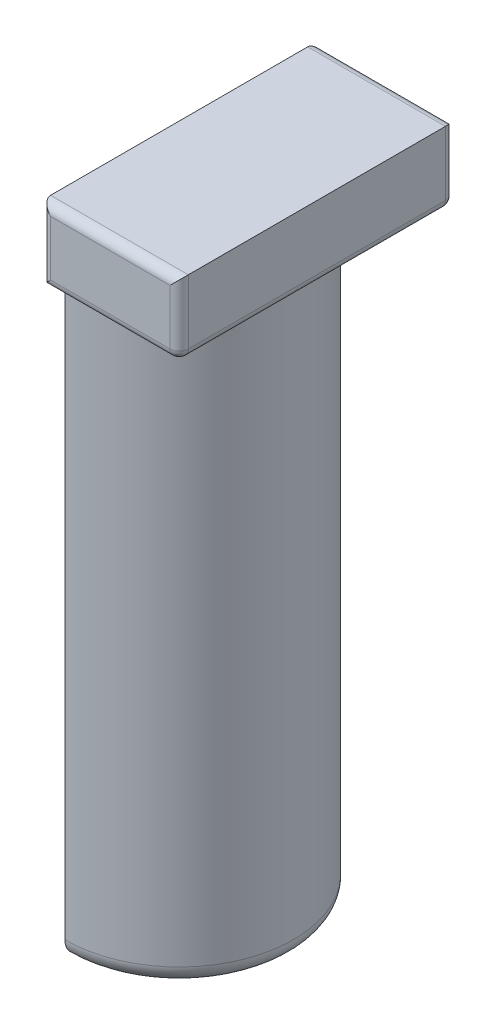
ISO-10303-21;
HEADER;
FILE_DESCRIPTION(('STEP AP214'),'2;1');
FILE_NAME('part.step','',(''),(''),'','','');
FILE_SCHEMA(('AUTOMOTIVE_DESIGN { 1 0 10303 214 1 1 1 1 }'));
ENDSEC;
DATA;
#1=APPLICATION_CONTEXT('core data for automotive mechanical design processes');
#2=APPLICATION_PROTOCOL_DEFINITION('international standard','automotive_design',2000,#1);
#3=PRODUCT_CONTEXT('',#1,'mechanical');
#4=PRODUCT('Part','Part','',(#3));
#5=PRODUCT_RELATED_PRODUCT_CATEGORY('part','',(#4));
#6=PRODUCT_DEFINITION_FORMATION('','',#4);
#7=PRODUCT_DEFINITION_CONTEXT('part definition',#1,'design');
#8=PRODUCT_DEFINITION('design','',#6,#7);
#9=PRODUCT_DEFINITION_SHAPE('','',#8);
#10=(LENGTH_UNIT() NAMED_UNIT(*) SI_UNIT(.MILLI.,.METRE.));
#11=(NAMED_UNIT(*) PLANE_ANGLE_UNIT() SI_UNIT($,.RADIAN.));
#12=(NAMED_UNIT(*) SI_UNIT($,.STERADIAN.) SOLID_ANGLE_UNIT());
#13=UNCERTAINTY_MEASURE_WITH_UNIT(LENGTH_MEASURE(1.E-05),#10,'distance_accuracy_value','');
#14=(GEOMETRIC_REPRESENTATION_CONTEXT(3) GLOBAL_UNCERTAINTY_ASSIGNED_CONTEXT((#13)) GLOBAL_UNIT_ASSIGNED_CONTEXT((#10,
#11,#12)) REPRESENTATION_CONTEXT('',''));
#15=CARTESIAN_POINT('',(0.,0.,0.));
#16=DIRECTION('',(0.,0.,1.));
#17=DIRECTION('',(1.,0.,0.));
#18=AXIS2_PLACEMENT_3D('',#15,#16,#17);
#19=CARTESIAN_POINT('',(0.,8.,0.));
#20=DIRECTION('',(-1.,0.,0.));
#21=DIRECTION('',(0.,0.,1.));
#22=AXIS2_PLACEMENT_3D('',#19,#20,#21);
#23=PLANE('',#22);
#24=DIRECTION('',(0.,0.,-1.));
#25=VECTOR('',#24,1.);
#26=CARTESIAN_POINT('',(0.,1.,0.));
#27=LINE('',#26,#25);
#28=CARTESIAN_POINT('',(0.,1.,-1.));
#29=VERTEX_POINT('',#28);
#30=CARTESIAN_POINT('',(0.,1.,-29.));
#31=VERTEX_POINT('',#30);
#32=EDGE_CURVE('E177',#29,#31,#27,.T.);
#33=ORIENTED_EDGE('',*,*,#32,.T.);
#34=DIRECTION('',(0.,-1.,0.));
#35=VECTOR('',#34,1.);
#36=CARTESIAN_POINT('',(0.,8.,-29.));
#37=LINE('',#36,#35);
#38=CARTESIAN_POINT('',(0.,8.,-29.));
#39=VERTEX_POINT('',#38);
#40=EDGE_CURVE('E181',#31,#39,#37,.F.);
#41=ORIENTED_EDGE('',*,*,#40,.T.);
#42=DIRECTION('',(0.,0.,-1.));
#43=VECTOR('',#42,1.);
#44=CARTESIAN_POINT('',(0.,8.,0.));
#45=LINE('',#44,#43);
#46=CARTESIAN_POINT('',(0.,8.,-1.));
#47=VERTEX_POINT('',#46);
#48=EDGE_CURVE('E153',#47,#39,#45,.T.);
#49=ORIENTED_EDGE('',*,*,#48,.F.);
#50=DIRECTION('',(0.,-1.,0.));
#51=VECTOR('',#50,1.);
#52=CARTESIAN_POINT('',(0.,8.,-1.));
#53=LINE('',#52,#51);
#54=EDGE_CURVE('E179',#47,#29,#53,.T.);
#55=ORIENTED_EDGE('',*,*,#54,.T.);
#56=EDGE_LOOP('',(#33,#41,#49,#55));
#57=FACE_BOUND('',#56,.T.);
#58=ADVANCED_FACE('F37',(#57),#23,.F.);
#59=CARTESIAN_POINT('',(0.,8.,-30.));
#60=DIRECTION('',(0.,0.,1.));
#61=DIRECTION('',(1.,0.,0.));
#62=AXIS2_PLACEMENT_3D('',#59,#60,#61);
#63=PLANE('',#62);
#64=DIRECTION('',(-1.,0.,0.));
#65=VECTOR('',#64,1.);
#66=CARTESIAN_POINT('',(0.,7.,-30.));
#67=LINE('',#66,#65);
#68=CARTESIAN_POINT('',(-14.,7.,-30.));
#69=VERTEX_POINT('',#68);
#70=CARTESIAN_POINT('',(-1.,7.,-30.));
#71=VERTEX_POINT('',#70);
#72=EDGE_CURVE('E172',#69,#71,#67,.F.);
#73=ORIENTED_EDGE('',*,*,#72,.T.);
#74=DIRECTION('',(0.,-1.,0.));
#75=VECTOR('',#74,1.);
#76=CARTESIAN_POINT('',(-1.,8.,-30.));
#77=LINE('',#76,#75);
#78=CARTESIAN_POINT('',(-1.,1.,-30.));
#79=VERTEX_POINT('',#78);
#80=EDGE_CURVE('E174',#71,#79,#77,.T.);
#81=ORIENTED_EDGE('',*,*,#80,.T.);
#82=DIRECTION('',(-1.,0.,0.));
#83=VECTOR('',#82,1.);
#84=CARTESIAN_POINT('',(0.,1.,-30.));
#85=LINE('',#84,#83);
#86=CARTESIAN_POINT('',(-14.,1.,-30.));
#87=VERTEX_POINT('',#86);
#88=EDGE_CURVE('E168',#79,#87,#85,.T.);
#89=ORIENTED_EDGE('',*,*,#88,.T.);
#90=DIRECTION('',(0.,1.,0.));
#91=VECTOR('',#90,1.);
#92=CARTESIAN_POINT('',(-14.,8.,-30.));
#93=LINE('',#92,#91);
#94=EDGE_CURVE('E170',#87,#69,#93,.T.);
#95=ORIENTED_EDGE('',*,*,#94,.T.);
#96=EDGE_LOOP('',(#73,#81,#89,#95));
#97=FACE_BOUND('',#96,.T.);
#98=ADVANCED_FACE('F252',(#97),#63,.F.);
#99=CARTESIAN_POINT('',(0.,8.,0.));
#100=DIRECTION('',(0.,0.,-1.));
#101=DIRECTION('',(-1.,0.,0.));
#102=AXIS2_PLACEMENT_3D('',#99,#100,#101);
#103=PLANE('',#102);
#104=DIRECTION('',(1.,0.,0.));
#105=VECTOR('',#104,1.);
#106=CARTESIAN_POINT('',(0.,1.,0.));
#107=LINE('',#106,#105);
#108=CARTESIAN_POINT('',(-14.,1.,0.));
#109=VERTEX_POINT('',#108);
#110=CARTESIAN_POINT('',(-1.,1.,0.));
#111=VERTEX_POINT('',#110);
#112=EDGE_CURVE('E46',#109,#111,#107,.T.);
#113=ORIENTED_EDGE('',*,*,#112,.T.);
#114=DIRECTION('',(0.,-1.,0.));
#115=VECTOR('',#114,1.);
#116=CARTESIAN_POINT('',(-1.,8.,0.));
#117=LINE('',#116,#115);
#118=CARTESIAN_POINT('',(-1.,7.,0.));
#119=VERTEX_POINT('',#118);
#120=EDGE_CURVE('E11',#111,#119,#117,.F.);
#121=ORIENTED_EDGE('',*,*,#120,.T.);
#122=DIRECTION('',(1.,0.,0.));
#123=VECTOR('',#122,1.);
#124=CARTESIAN_POINT('',(-15.,7.,0.));
#125=LINE('',#124,#123);
#126=CARTESIAN_POINT('',(-14.,7.,0.));
#127=VERTEX_POINT('',#126);
#128=EDGE_CURVE('E197',#119,#127,#125,.F.);
#129=ORIENTED_EDGE('',*,*,#128,.T.);
#130=DIRECTION('',(0.,1.,0.));
#131=VECTOR('',#130,1.);
#132=CARTESIAN_POINT('',(-14.,8.,0.));
#133=LINE('',#132,#131);
#134=EDGE_CURVE('E57',#127,#109,#133,.F.);
#135=ORIENTED_EDGE('',*,*,#134,.T.);
#136=EDGE_LOOP('',(#113,#121,#129,#135));
#137=FACE_BOUND('',#136,.T.);
#138=ADVANCED_FACE('F285',(#137),#103,.F.);
#139=CARTESIAN_POINT('',(0.,8.,0.));
#140=DIRECTION('',(0.,1.,0.));
#141=DIRECTION('',(0.,0.,1.));
#142=AXIS2_PLACEMENT_3D('',#139,#140,#141);
#143=PLANE('',#142);
#144=ORIENTED_EDGE('',*,*,#48,.T.);
#145=DIRECTION('',(-1.,0.,0.));
#146=VECTOR('',#145,1.);
#147=CARTESIAN_POINT('',(-15.,8.,-29.));
#148=LINE('',#147,#146);
#149=CARTESIAN_POINT('',(-15.,8.,-29.));
#150=VERTEX_POINT('',#149);
#151=EDGE_CURVE('E186',#39,#150,#148,.T.);
#152=ORIENTED_EDGE('',*,*,#151,.T.);
#153=DIRECTION('',(0.,0.,-1.));
#154=VECTOR('',#153,1.);
#155=CARTESIAN_POINT('',(-15.,8.,-30.));
#156=LINE('',#155,#154);
#157=CARTESIAN_POINT('',(-15.,8.,-0.999999999999997));
#158=VERTEX_POINT('',#157);
#159=EDGE_CURVE('E147',#158,#150,#156,.T.);
#160=ORIENTED_EDGE('',*,*,#159,.F.);
#161=DIRECTION('',(1.,0.,0.));
#162=VECTOR('',#161,1.);
#163=CARTESIAN_POINT('',(0.,8.,-1.));
#164=LINE('',#163,#162);
#165=EDGE_CURVE('E184',#158,#47,#164,.T.);
#166=ORIENTED_EDGE('',*,*,#165,.T.);
#167=EDGE_LOOP('',(#144,#152,#160,#166));
#168=FACE_BOUND('',#167,.T.);
#169=ADVANCED_FACE('F408',(#168),#143,.T.);
#170=CARTESIAN_POINT('',(0.,0.,0.));
#171=DIRECTION('',(0.,1.,0.));
#172=DIRECTION('',(0.,0.,1.));
#173=AXIS2_PLACEMENT_3D('',#170,#171,#172);
#174=PLANE('',#173);
#175=DIRECTION('',(0.,0.,-1.));
#176=VECTOR('',#175,1.);
#177=CARTESIAN_POINT('',(-15.,0.,0.));
#178=LINE('',#177,#176);
#179=CARTESIAN_POINT('',(-15.,0.,-27.45));
#180=VERTEX_POINT('',#179);
#181=CARTESIAN_POINT('',(-15.,0.,-29.));
#182=VERTEX_POINT('',#181);
#183=EDGE_CURVE('E139',#180,#182,#178,.T.);
#184=ORIENTED_EDGE('',*,*,#183,.T.);
#185=DIRECTION('',(-1.,0.,0.));
#186=VECTOR('',#185,1.);
#187=CARTESIAN_POINT('',(0.,0.,-29.));
#188=LINE('',#187,#186);
#189=CARTESIAN_POINT('',(-1.,0.,-29.));
#190=VERTEX_POINT('',#189);
#191=EDGE_CURVE('E195',#182,#190,#188,.F.);
#192=ORIENTED_EDGE('',*,*,#191,.T.);
#193=DIRECTION('',(0.,0.,-1.));
#194=VECTOR('',#193,1.);
#195=CARTESIAN_POINT('',(-1.,0.,0.));
#196=LINE('',#195,#194);
#197=CARTESIAN_POINT('',(-1.,0.,-1.));
#198=VERTEX_POINT('',#197);
#199=EDGE_CURVE('E192',#190,#198,#196,.F.);
#200=ORIENTED_EDGE('',*,*,#199,.T.);
#201=DIRECTION('',(1.,0.,0.));
#202=VECTOR('',#201,1.);
#203=CARTESIAN_POINT('',(0.,0.,-1.));
#204=LINE('',#203,#202);
#205=CARTESIAN_POINT('',(-15.,0.,-1.));
#206=VERTEX_POINT('',#205);
#207=EDGE_CURVE('E133',#198,#206,#204,.F.);
#208=ORIENTED_EDGE('',*,*,#207,.T.);
#209=CARTESIAN_POINT('',(-15.,0.,-2.55));
#210=VERTEX_POINT('',#209);
#211=EDGE_CURVE('E126',#206,#210,#178,.T.);
#212=ORIENTED_EDGE('',*,*,#211,.T.);
#213=CARTESIAN_POINT('',(-15.,0.,-15.));
#214=DIRECTION('',(0.,-1.,0.));
#215=DIRECTION('',(0.,0.,-1.));
#216=AXIS2_PLACEMENT_3D('',#213,#214,#215);
#217=CIRCLE('',#216,12.45);
#218=EDGE_CURVE('E131',#180,#210,#217,.T.);
#219=ORIENTED_EDGE('',*,*,#218,.F.);
#220=EDGE_LOOP('',(#184,#192,#200,#208,#212,#219));
#221=FACE_BOUND('',#220,.T.);
#222=ADVANCED_FACE('F129',(#221),#174,.F.);
#223=CARTESIAN_POINT('',(-15.,-65.,-15.));
#224=DIRECTION('',(0.,1.,0.));
#225=DIRECTION('',(0.,0.,1.));
#226=AXIS2_PLACEMENT_3D('',#223,#224,#225);
#227=CYLINDRICAL_SURFACE('',#226,12.45);
#228=DIRECTION('',(0.,1.,0.));
#229=VECTOR('',#228,1.);
#230=CARTESIAN_POINT('',(-15.,-65.,-2.55));
#231=LINE('',#230,#229);
#232=CARTESIAN_POINT('',(-15.,-63.,-2.55));
#233=VERTEX_POINT('',#232);
#234=EDGE_CURVE('E137',#210,#233,#231,.F.);
#235=ORIENTED_EDGE('',*,*,#234,.T.);
#236=CARTESIAN_POINT('',(-15.,-63.,-15.));
#237=DIRECTION('',(0.,-1.,0.));
#238=DIRECTION('',(0.,0.,-1.));
#239=AXIS2_PLACEMENT_3D('',#236,#237,#238);
#240=CIRCLE('',#239,12.45);
#241=CARTESIAN_POINT('',(-15.,-63.,-27.45));
#242=VERTEX_POINT('',#241);
#243=EDGE_CURVE('E166',#233,#242,#240,.F.);
#244=ORIENTED_EDGE('',*,*,#243,.T.);
#245=DIRECTION('',(0.,1.,0.));
#246=VECTOR('',#245,1.);
#247=CARTESIAN_POINT('',(-15.,-65.,-27.45));
#248=LINE('',#247,#246);
#249=EDGE_CURVE('E136',#242,#180,#248,.T.);
#250=ORIENTED_EDGE('',*,*,#249,.T.);
#251=ORIENTED_EDGE('',*,*,#218,.T.);
#252=EDGE_LOOP('',(#235,#244,#250,#251));
#253=FACE_BOUND('',#252,.T.);
#254=ADVANCED_FACE('F149',(#253),#227,.T.);
#255=CARTESIAN_POINT('',(-15.,-65.,-15.));
#256=DIRECTION('',(0.,-1.,0.));
#257=DIRECTION('',(0.,0.,-1.));
#258=AXIS2_PLACEMENT_3D('',#255,#256,#257);
#259=PLANE('',#258);
#260=DIRECTION('',(0.,0.,1.));
#261=VECTOR('',#260,1.);
#262=CARTESIAN_POINT('',(-15.,-65.,-15.));
#263=LINE('',#262,#261);
#264=CARTESIAN_POINT('',(-15.,-65.,-25.45));
#265=VERTEX_POINT('',#264);
#266=CARTESIAN_POINT('',(-15.,-65.,-4.55));
#267=VERTEX_POINT('',#266);
#268=EDGE_CURVE('E152',#265,#267,#263,.T.);
#269=ORIENTED_EDGE('',*,*,#268,.F.);
#270=CARTESIAN_POINT('',(-15.,-65.,-15.));
#271=DIRECTION('',(0.,-1.,0.));
#272=DIRECTION('',(0.,0.,-1.));
#273=AXIS2_PLACEMENT_3D('',#270,#271,#272);
#274=CIRCLE('',#273,10.45);
#275=EDGE_CURVE('E155',#265,#267,#274,.T.);
#276=ORIENTED_EDGE('',*,*,#275,.T.);
#277=EDGE_LOOP('',(#269,#276));
#278=FACE_BOUND('',#277,.T.);
#279=ADVANCED_FACE('F386',(#278),#259,.T.);
#280=CARTESIAN_POINT('',(-15.,-65.,-30.));
#281=DIRECTION('',(1.,0.,0.));
#282=DIRECTION('',(0.,1.,0.));
#283=AXIS2_PLACEMENT_3D('',#280,#281,#282);
#284=PLANE('',#283);
#285=ORIENTED_EDGE('',*,*,#159,.T.);
#286=DIRECTION('',(0.,1.,0.));
#287=VECTOR('',#286,1.);
#288=CARTESIAN_POINT('',(-15.,-65.,-29.));
#289=LINE('',#288,#287);
#290=EDGE_CURVE('E190',#150,#182,#289,.F.);
#291=ORIENTED_EDGE('',*,*,#290,.T.);
#292=ORIENTED_EDGE('',*,*,#183,.F.);
#293=ORIENTED_EDGE('',*,*,#249,.F.);
#294=CARTESIAN_POINT('',(-15.,-63.,-25.45));
#295=DIRECTION('',(1.,0.,0.));
#296=DIRECTION('',(0.,1.,0.));
#297=AXIS2_PLACEMENT_3D('',#294,#295,#296);
#298=CIRCLE('',#297,2.);
#299=EDGE_CURVE('E163',#242,#265,#298,.F.);
#300=ORIENTED_EDGE('',*,*,#299,.T.);
#301=ORIENTED_EDGE('',*,*,#268,.T.);
#302=CARTESIAN_POINT('',(-15.,-63.,-4.55));
#303=DIRECTION('',(1.,0.,0.));
#304=DIRECTION('',(0.,1.,0.));
#305=AXIS2_PLACEMENT_3D('',#302,#303,#304);
#306=CIRCLE('',#305,2.);
#307=EDGE_CURVE('E144',#267,#233,#306,.F.);
#308=ORIENTED_EDGE('',*,*,#307,.T.);
#309=ORIENTED_EDGE('',*,*,#234,.F.);
#310=ORIENTED_EDGE('',*,*,#211,.F.);
#311=DIRECTION('',(0.,1.,0.));
#312=VECTOR('',#311,1.);
#313=CARTESIAN_POINT('',(-15.,-65.,-1.));
#314=LINE('',#313,#312);
#315=EDGE_CURVE('E188',#206,#158,#314,.T.);
#316=ORIENTED_EDGE('',*,*,#315,.T.);
#317=EDGE_LOOP('',(#285,#291,#292,#293,#300,#301,#308,#309,#310,#316));
#318=FACE_BOUND('',#317,.T.);
#319=ADVANCED_FACE('F142',(#318),#284,.F.);
#320=CARTESIAN_POINT('',(-15.,-63.,-15.));
#321=DIRECTION('',(0.,-1.,0.));
#322=DIRECTION('',(0.,0.,-1.));
#323=AXIS2_PLACEMENT_3D('',#320,#321,#322);
#324=TOROIDAL_SURFACE('',#323,10.45,2.);
#325=ORIENTED_EDGE('',*,*,#299,.F.);
#326=ORIENTED_EDGE('',*,*,#243,.F.);
#327=ORIENTED_EDGE('',*,*,#307,.F.);
#328=ORIENTED_EDGE('',*,*,#275,.F.);
#329=EDGE_LOOP('',(#325,#326,#327,#328));
#330=FACE_BOUND('',#329,.T.);
#331=ADVANCED_FACE('F289',(#330),#324,.T.);
#332=CARTESIAN_POINT('',(-14.,-65.,-1.));
#333=DIRECTION('',(0.,1.,0.));
#334=DIRECTION('',(-1.,0.,0.));
#335=AXIS2_PLACEMENT_3D('',#332,#333,#334);
#336=CYLINDRICAL_SURFACE('',#335,1.);
#337=CARTESIAN_POINT('',(-14.,1.,-1.));
#338=DIRECTION('',(-0.707106781186547,0.707106781186547,0.));
#339=DIRECTION('',(0.707106781186547,0.707106781186547,0.));
#340=AXIS2_PLACEMENT_3D('',#337,#338,#339);
#341=ELLIPSE('',#340,1.41421356237309,1.);
#342=EDGE_CURVE('E227',#109,#206,#341,.F.);
#343=ORIENTED_EDGE('',*,*,#342,.F.);
#344=ORIENTED_EDGE('',*,*,#134,.F.);
#345=CARTESIAN_POINT('',(-14.,7.,-1.));
#346=DIRECTION('',(-0.707106781186547,-0.707106781186547,0.));
#347=DIRECTION('',(-0.707106781186547,0.707106781186547,0.));
#348=AXIS2_PLACEMENT_3D('',#345,#346,#347);
#349=ELLIPSE('',#348,1.41421356237309,1.);
#350=EDGE_CURVE('E41',#158,#127,#349,.F.);
#351=ORIENTED_EDGE('',*,*,#350,.F.);
#352=ORIENTED_EDGE('',*,*,#315,.F.);
#353=EDGE_LOOP('',(#343,#344,#351,#352));
#354=FACE_BOUND('',#353,.T.);
#355=ADVANCED_FACE('F39',(#354),#336,.T.);
#356=CARTESIAN_POINT('',(0.,7.,-1.));
#357=DIRECTION('',(-1.,0.,0.));
#358=DIRECTION('',(0.,0.,1.));
#359=AXIS2_PLACEMENT_3D('',#356,#357,#358);
#360=CYLINDRICAL_SURFACE('',#359,1.);
#361=ORIENTED_EDGE('',*,*,#350,.T.);
#362=ORIENTED_EDGE('',*,*,#128,.F.);
#363=CARTESIAN_POINT('',(-1.,7.,-1.));
#364=DIRECTION('',(-0.707106781186547,0.707106781186547,0.));
#365=DIRECTION('',(-0.707106781186547,-0.707106781186547,0.));
#366=AXIS2_PLACEMENT_3D('',#363,#364,#365);
#367=ELLIPSE('',#366,1.41421356237309,1.);
#368=EDGE_CURVE('E226',#47,#119,#367,.F.);
#369=ORIENTED_EDGE('',*,*,#368,.F.);
#370=ORIENTED_EDGE('',*,*,#165,.F.);
#371=EDGE_LOOP('',(#361,#362,#369,#370));
#372=FACE_BOUND('',#371,.T.);
#373=ADVANCED_FACE('F271',(#372),#360,.T.);
#374=CARTESIAN_POINT('',(0.,1.,-1.));
#375=DIRECTION('',(1.,0.,0.));
#376=DIRECTION('',(0.,0.,-1.));
#377=AXIS2_PLACEMENT_3D('',#374,#375,#376);
#378=CYLINDRICAL_SURFACE('',#377,1.);
#379=ORIENTED_EDGE('',*,*,#342,.T.);
#380=ORIENTED_EDGE('',*,*,#207,.F.);
#381=CARTESIAN_POINT('',(-1.,1.,-1.));
#382=DIRECTION('',(1.,0.,0.));
#383=DIRECTION('',(0.,0.,-1.));
#384=AXIS2_PLACEMENT_3D('',#381,#382,#383);
#385=CIRCLE('',#384,1.);
#386=EDGE_CURVE('E223',#111,#198,#385,.T.);
#387=ORIENTED_EDGE('',*,*,#386,.F.);
#388=ORIENTED_EDGE('',*,*,#112,.F.);
#389=EDGE_LOOP('',(#379,#380,#387,#388));
#390=FACE_BOUND('',#389,.T.);
#391=ADVANCED_FACE('F268',(#390),#378,.T.);
#392=CARTESIAN_POINT('',(-1.,8.,-1.));
#393=DIRECTION('',(0.,-1.,0.));
#394=DIRECTION('',(0.,0.,-1.));
#395=AXIS2_PLACEMENT_3D('',#392,#393,#394);
#396=CYLINDRICAL_SURFACE('',#395,1.);
#397=ORIENTED_EDGE('',*,*,#368,.T.);
#398=ORIENTED_EDGE('',*,*,#120,.F.);
#399=CARTESIAN_POINT('',(-1.,1.,-1.));
#400=DIRECTION('',(0.,-1.,0.));
#401=DIRECTION('',(0.,0.,-1.));
#402=AXIS2_PLACEMENT_3D('',#399,#400,#401);
#403=CIRCLE('',#402,1.);
#404=EDGE_CURVE('E220',#29,#111,#403,.T.);
#405=ORIENTED_EDGE('',*,*,#404,.F.);
#406=ORIENTED_EDGE('',*,*,#54,.F.);
#407=EDGE_LOOP('',(#397,#398,#405,#406));
#408=FACE_BOUND('',#407,.T.);
#409=ADVANCED_FACE('F270',(#408),#396,.T.);
#410=CARTESIAN_POINT('',(-1.,1.,-1.));
#411=DIRECTION('',(0.,0.,1.));
#412=DIRECTION('',(1.,0.,0.));
#413=AXIS2_PLACEMENT_3D('',#410,#411,#412);
#414=SPHERICAL_SURFACE('',#413,1.);
#415=ORIENTED_EDGE('',*,*,#404,.T.);
#416=ORIENTED_EDGE('',*,*,#386,.T.);
#417=CARTESIAN_POINT('',(-1.,1.,-1.));
#418=DIRECTION('',(0.,0.,1.));
#419=DIRECTION('',(1.,0.,0.));
#420=AXIS2_PLACEMENT_3D('',#417,#418,#419);
#421=CIRCLE('',#420,1.);
#422=EDGE_CURVE('E214',#29,#198,#421,.F.);
#423=ORIENTED_EDGE('',*,*,#422,.F.);
#424=EDGE_LOOP('',(#415,#416,#423));
#425=FACE_BOUND('',#424,.T.);
#426=ADVANCED_FACE('F265',(#425),#414,.T.);
#427=CARTESIAN_POINT('',(-14.,8.,-29.));
#428=DIRECTION('',(0.,1.,0.));
#429=DIRECTION('',(-1.,0.,0.));
#430=AXIS2_PLACEMENT_3D('',#427,#428,#429);
#431=CYLINDRICAL_SURFACE('',#430,1.);
#432=CARTESIAN_POINT('',(-14.,7.,-29.));
#433=DIRECTION('',(0.707106781186547,0.707106781186547,0.));
#434=DIRECTION('',(-0.707106781186547,0.707106781186547,0.));
#435=AXIS2_PLACEMENT_3D('',#432,#433,#434);
#436=ELLIPSE('',#435,1.41421356237309,1.);
#437=EDGE_CURVE('E211',#69,#150,#436,.T.);
#438=ORIENTED_EDGE('',*,*,#437,.F.);
#439=ORIENTED_EDGE('',*,*,#94,.F.);
#440=CARTESIAN_POINT('',(-14.,1.,-29.));
#441=DIRECTION('',(-0.707106781186547,0.707106781186547,0.));
#442=DIRECTION('',(-0.707106781186547,-0.707106781186547,0.));
#443=AXIS2_PLACEMENT_3D('',#440,#441,#442);
#444=ELLIPSE('',#443,1.41421356237309,1.);
#445=EDGE_CURVE('E217',#182,#87,#444,.F.);
#446=ORIENTED_EDGE('',*,*,#445,.F.);
#447=ORIENTED_EDGE('',*,*,#290,.F.);
#448=EDGE_LOOP('',(#438,#439,#446,#447));
#449=FACE_BOUND('',#448,.T.);
#450=ADVANCED_FACE('F242',(#449),#431,.T.);
#451=CARTESIAN_POINT('',(0.,1.,-29.));
#452=DIRECTION('',(-1.,0.,0.));
#453=DIRECTION('',(0.,0.,1.));
#454=AXIS2_PLACEMENT_3D('',#451,#452,#453);
#455=CYLINDRICAL_SURFACE('',#454,1.);
#456=ORIENTED_EDGE('',*,*,#445,.T.);
#457=ORIENTED_EDGE('',*,*,#88,.F.);
#458=CARTESIAN_POINT('',(-1.,1.,-29.));
#459=DIRECTION('',(1.,0.,0.));
#460=DIRECTION('',(0.,0.,-1.));
#461=AXIS2_PLACEMENT_3D('',#458,#459,#460);
#462=CIRCLE('',#461,1.);
#463=EDGE_CURVE('E208',#190,#79,#462,.T.);
#464=ORIENTED_EDGE('',*,*,#463,.F.);
#465=ORIENTED_EDGE('',*,*,#191,.F.);
#466=EDGE_LOOP('',(#456,#457,#464,#465));
#467=FACE_BOUND('',#466,.T.);
#468=ADVANCED_FACE('F255',(#467),#455,.T.);
#469=CARTESIAN_POINT('',(-1.,1.,0.));
#470=DIRECTION('',(0.,0.,-1.));
#471=DIRECTION('',(-1.,0.,0.));
#472=AXIS2_PLACEMENT_3D('',#469,#470,#471);
#473=CYLINDRICAL_SURFACE('',#472,1.);
#474=ORIENTED_EDGE('',*,*,#422,.T.);
#475=ORIENTED_EDGE('',*,*,#199,.F.);
#476=CARTESIAN_POINT('',(-1.,1.,-29.));
#477=DIRECTION('',(0.,0.,-1.));
#478=DIRECTION('',(-1.,0.,0.));
#479=AXIS2_PLACEMENT_3D('',#476,#477,#478);
#480=CIRCLE('',#479,1.);
#481=EDGE_CURVE('E205',#31,#190,#480,.T.);
#482=ORIENTED_EDGE('',*,*,#481,.F.);
#483=ORIENTED_EDGE('',*,*,#32,.F.);
#484=EDGE_LOOP('',(#474,#475,#482,#483));
#485=FACE_BOUND('',#484,.T.);
#486=ADVANCED_FACE('F260',(#485),#473,.T.);
#487=CARTESIAN_POINT('',(0.,7.,-29.));
#488=DIRECTION('',(1.,0.,0.));
#489=DIRECTION('',(0.,0.,-1.));
#490=AXIS2_PLACEMENT_3D('',#487,#488,#489);
#491=CYLINDRICAL_SURFACE('',#490,1.);
#492=ORIENTED_EDGE('',*,*,#437,.T.);
#493=ORIENTED_EDGE('',*,*,#151,.F.);
#494=CARTESIAN_POINT('',(-1.,7.,-29.));
#495=DIRECTION('',(0.707106781186547,-0.707106781186547,0.));
#496=DIRECTION('',(0.707106781186547,0.707106781186547,0.));
#497=AXIS2_PLACEMENT_3D('',#494,#495,#496);
#498=ELLIPSE('',#497,1.41421356237309,1.);
#499=EDGE_CURVE('E203',#71,#39,#498,.T.);
#500=ORIENTED_EDGE('',*,*,#499,.F.);
#501=ORIENTED_EDGE('',*,*,#72,.F.);
#502=EDGE_LOOP('',(#492,#493,#500,#501));
#503=FACE_BOUND('',#502,.T.);
#504=ADVANCED_FACE('F248',(#503),#491,.T.);
#505=CARTESIAN_POINT('',(-1.,1.,-29.));
#506=DIRECTION('',(0.,-1.,0.));
#507=DIRECTION('',(0.,0.,-1.));
#508=AXIS2_PLACEMENT_3D('',#505,#506,#507);
#509=SPHERICAL_SURFACE('',#508,1.);
#510=ORIENTED_EDGE('',*,*,#481,.T.);
#511=ORIENTED_EDGE('',*,*,#463,.T.);
#512=CARTESIAN_POINT('',(-1.,1.,-29.));
#513=DIRECTION('',(0.,-1.,0.));
#514=DIRECTION('',(0.,0.,-1.));
#515=AXIS2_PLACEMENT_3D('',#512,#513,#514);
#516=CIRCLE('',#515,1.);
#517=EDGE_CURVE('E201',#31,#79,#516,.F.);
#518=ORIENTED_EDGE('',*,*,#517,.F.);
#519=EDGE_LOOP('',(#510,#511,#518));
#520=FACE_BOUND('',#519,.T.);
#521=ADVANCED_FACE('F296',(#520),#509,.T.);
#522=CARTESIAN_POINT('',(-1.,8.,-29.));
#523=DIRECTION('',(0.,-1.,0.));
#524=DIRECTION('',(0.,0.,-1.));
#525=AXIS2_PLACEMENT_3D('',#522,#523,#524);
#526=CYLINDRICAL_SURFACE('',#525,1.);
#527=ORIENTED_EDGE('',*,*,#499,.T.);
#528=ORIENTED_EDGE('',*,*,#40,.F.);
#529=ORIENTED_EDGE('',*,*,#517,.T.);
#530=ORIENTED_EDGE('',*,*,#80,.F.);
#531=EDGE_LOOP('',(#527,#528,#529,#530));
#532=FACE_BOUND('',#531,.T.);
#533=ADVANCED_FACE('F293',(#532),#526,.T.);
#534=CLOSED_SHELL('',(#58,#98,#138,#169,#222,#254,#279,#319,#331,#355,#373,#391,#409,#426,#450,
#468,#486,#504,#521,#533));
#535=MANIFOLD_SOLID_BREP('B2',#534);
#536=ADVANCED_BREP_SHAPE_REPRESENTATION('',(#18,#535),#14);
#537=SHAPE_DEFINITION_REPRESENTATION(#9,#536);
ENDSEC;
END-ISO-10303-21;
